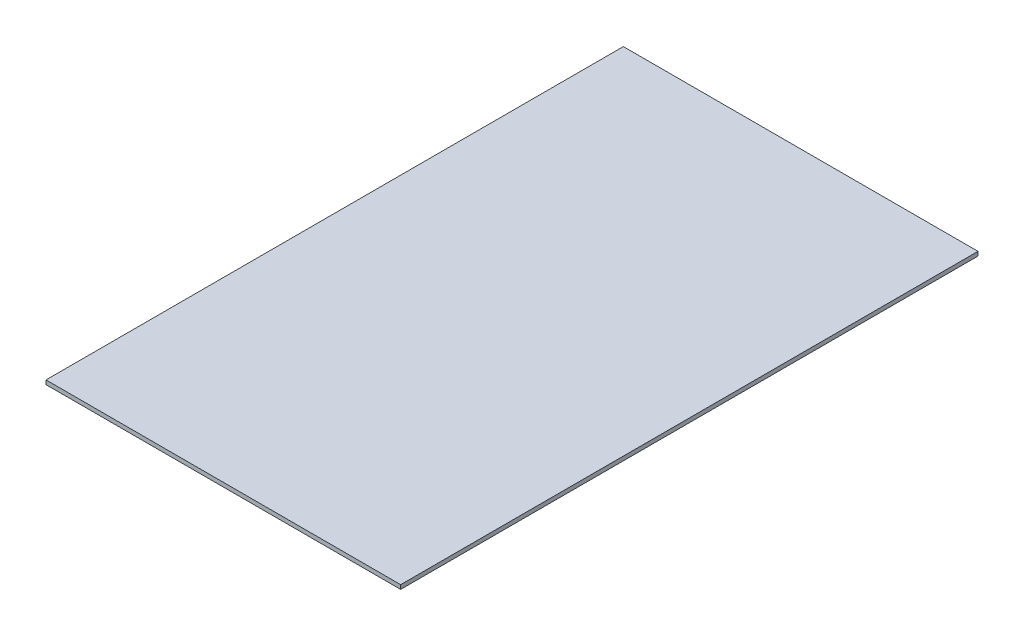
ISO-10303-21;
HEADER;
FILE_DESCRIPTION(('STEP AP214'),'2;1');
FILE_NAME('part.step','',(''),(''),'','','');
FILE_SCHEMA(('AUTOMOTIVE_DESIGN { 1 0 10303 214 1 1 1 1 }'));
ENDSEC;
DATA;
#1=APPLICATION_CONTEXT('core data for automotive mechanical design processes');
#2=APPLICATION_PROTOCOL_DEFINITION('international standard','automotive_design',2000,#1);
#3=PRODUCT_CONTEXT('',#1,'mechanical');
#4=PRODUCT('Part','Part','',(#3));
#5=PRODUCT_RELATED_PRODUCT_CATEGORY('part','',(#4));
#6=PRODUCT_DEFINITION_FORMATION('','',#4);
#7=PRODUCT_DEFINITION_CONTEXT('part definition',#1,'design');
#8=PRODUCT_DEFINITION('design','',#6,#7);
#9=PRODUCT_DEFINITION_SHAPE('','',#8);
#10=(LENGTH_UNIT() NAMED_UNIT(*) SI_UNIT(.MILLI.,.METRE.));
#11=(NAMED_UNIT(*) PLANE_ANGLE_UNIT() SI_UNIT($,.RADIAN.));
#12=(NAMED_UNIT(*) SI_UNIT($,.STERADIAN.) SOLID_ANGLE_UNIT());
#13=UNCERTAINTY_MEASURE_WITH_UNIT(LENGTH_MEASURE(1.E-05),#10,'distance_accuracy_value','');
#14=(GEOMETRIC_REPRESENTATION_CONTEXT(3) GLOBAL_UNCERTAINTY_ASSIGNED_CONTEXT((#13)) GLOBAL_UNIT_ASSIGNED_CONTEXT((#10,
#11,#12)) REPRESENTATION_CONTEXT('',''));
#15=CARTESIAN_POINT('',(0.,0.,0.));
#16=DIRECTION('',(0.,0.,1.));
#17=DIRECTION('',(1.,0.,0.));
#18=AXIS2_PLACEMENT_3D('',#15,#16,#17);
#19=CARTESIAN_POINT('',(0.,1.,0.));
#20=DIRECTION('',(1.,0.,0.));
#21=DIRECTION('',(0.,0.,-1.));
#22=AXIS2_PLACEMENT_3D('',#19,#20,#21);
#23=PLANE('',#22);
#24=DIRECTION('',(0.,0.,1.));
#25=VECTOR('',#24,1.);
#26=CARTESIAN_POINT('',(0.,0.,0.));
#27=LINE('',#26,#25);
#28=CARTESIAN_POINT('',(0.,0.,-140.));
#29=VERTEX_POINT('',#28);
#30=CARTESIAN_POINT('',(0.,0.,0.));
#31=VERTEX_POINT('',#30);
#32=EDGE_CURVE('E111',#29,#31,#27,.T.);
#33=ORIENTED_EDGE('',*,*,#32,.T.);
#34=DIRECTION('',(0.,-1.,0.));
#35=VECTOR('',#34,1.);
#36=CARTESIAN_POINT('',(0.,1.,0.));
#37=LINE('',#36,#35);
#38=CARTESIAN_POINT('',(0.,1.,0.));
#39=VERTEX_POINT('',#38);
#40=EDGE_CURVE('E11',#39,#31,#37,.T.);
#41=ORIENTED_EDGE('',*,*,#40,.F.);
#42=DIRECTION('',(0.,0.,1.));
#43=VECTOR('',#42,1.);
#44=CARTESIAN_POINT('',(0.,1.,0.));
#45=LINE('',#44,#43);
#46=CARTESIAN_POINT('',(0.,1.,-140.));
#47=VERTEX_POINT('',#46);
#48=EDGE_CURVE('E95',#47,#39,#45,.T.);
#49=ORIENTED_EDGE('',*,*,#48,.F.);
#50=DIRECTION('',(0.,-1.,0.));
#51=VECTOR('',#50,1.);
#52=CARTESIAN_POINT('',(0.,1.,-140.));
#53=LINE('',#52,#51);
#54=EDGE_CURVE('E107',#47,#29,#53,.T.);
#55=ORIENTED_EDGE('',*,*,#54,.T.);
#56=EDGE_LOOP('',(#33,#41,#49,#55));
#57=FACE_BOUND('',#56,.T.);
#58=ADVANCED_FACE('F43',(#57),#23,.F.);
#59=CARTESIAN_POINT('',(0.,1.,0.));
#60=DIRECTION('',(0.,0.,-1.));
#61=DIRECTION('',(-1.,0.,0.));
#62=AXIS2_PLACEMENT_3D('',#59,#60,#61);
#63=PLANE('',#62);
#64=DIRECTION('',(1.,0.,0.));
#65=VECTOR('',#64,1.);
#66=CARTESIAN_POINT('',(0.,0.,0.));
#67=LINE('',#66,#65);
#68=CARTESIAN_POINT('',(86.,0.,0.));
#69=VERTEX_POINT('',#68);
#70=EDGE_CURVE('E100',#31,#69,#67,.T.);
#71=ORIENTED_EDGE('',*,*,#70,.T.);
#72=DIRECTION('',(0.,-1.,0.));
#73=VECTOR('',#72,1.);
#74=CARTESIAN_POINT('',(86.,1.,0.));
#75=LINE('',#74,#73);
#76=CARTESIAN_POINT('',(86.,1.,0.));
#77=VERTEX_POINT('',#76);
#78=EDGE_CURVE('E52',#77,#69,#75,.T.);
#79=ORIENTED_EDGE('',*,*,#78,.F.);
#80=DIRECTION('',(1.,0.,0.));
#81=VECTOR('',#80,1.);
#82=CARTESIAN_POINT('',(0.,1.,0.));
#83=LINE('',#82,#81);
#84=EDGE_CURVE('E90',#39,#77,#83,.T.);
#85=ORIENTED_EDGE('',*,*,#84,.F.);
#86=ORIENTED_EDGE('',*,*,#40,.T.);
#87=EDGE_LOOP('',(#71,#79,#85,#86));
#88=FACE_BOUND('',#87,.T.);
#89=ADVANCED_FACE('F99',(#88),#63,.F.);
#90=CARTESIAN_POINT('',(86.,1.,0.));
#91=DIRECTION('',(-1.,0.,0.));
#92=DIRECTION('',(0.,0.,1.));
#93=AXIS2_PLACEMENT_3D('',#90,#91,#92);
#94=PLANE('',#93);
#95=DIRECTION('',(0.,0.,-1.));
#96=VECTOR('',#95,1.);
#97=CARTESIAN_POINT('',(86.,0.,0.));
#98=LINE('',#97,#96);
#99=CARTESIAN_POINT('',(86.,0.,-140.));
#100=VERTEX_POINT('',#99);
#101=EDGE_CURVE('E77',#69,#100,#98,.T.);
#102=ORIENTED_EDGE('',*,*,#101,.T.);
#103=DIRECTION('',(0.,-1.,0.));
#104=VECTOR('',#103,1.);
#105=CARTESIAN_POINT('',(86.,1.,-140.));
#106=LINE('',#105,#104);
#107=CARTESIAN_POINT('',(86.,1.,-140.));
#108=VERTEX_POINT('',#107);
#109=EDGE_CURVE('E102',#108,#100,#106,.T.);
#110=ORIENTED_EDGE('',*,*,#109,.F.);
#111=DIRECTION('',(0.,0.,-1.));
#112=VECTOR('',#111,1.);
#113=CARTESIAN_POINT('',(86.,1.,0.));
#114=LINE('',#113,#112);
#115=EDGE_CURVE('E93',#77,#108,#114,.T.);
#116=ORIENTED_EDGE('',*,*,#115,.F.);
#117=ORIENTED_EDGE('',*,*,#78,.T.);
#118=EDGE_LOOP('',(#102,#110,#116,#117));
#119=FACE_BOUND('',#118,.T.);
#120=ADVANCED_FACE('F103',(#119),#94,.F.);
#121=CARTESIAN_POINT('',(0.,1.,-140.));
#122=DIRECTION('',(0.,0.,1.));
#123=DIRECTION('',(1.,0.,0.));
#124=AXIS2_PLACEMENT_3D('',#121,#122,#123);
#125=PLANE('',#124);
#126=DIRECTION('',(-1.,0.,0.));
#127=VECTOR('',#126,1.);
#128=CARTESIAN_POINT('',(0.,0.,-140.));
#129=LINE('',#128,#127);
#130=EDGE_CURVE('E83',#100,#29,#129,.T.);
#131=ORIENTED_EDGE('',*,*,#130,.T.);
#132=ORIENTED_EDGE('',*,*,#54,.F.);
#133=DIRECTION('',(-1.,0.,0.));
#134=VECTOR('',#133,1.);
#135=CARTESIAN_POINT('',(0.,1.,-140.));
#136=LINE('',#135,#134);
#137=EDGE_CURVE('E60',#108,#47,#136,.T.);
#138=ORIENTED_EDGE('',*,*,#137,.F.);
#139=ORIENTED_EDGE('',*,*,#109,.T.);
#140=EDGE_LOOP('',(#131,#132,#138,#139));
#141=FACE_BOUND('',#140,.T.);
#142=ADVANCED_FACE('F124',(#141),#125,.F.);
#143=CARTESIAN_POINT('',(0.,1.,0.));
#144=DIRECTION('',(0.,-1.,0.));
#145=DIRECTION('',(0.,0.,-1.));
#146=AXIS2_PLACEMENT_3D('',#143,#144,#145);
#147=PLANE('',#146);
#148=ORIENTED_EDGE('',*,*,#48,.T.);
#149=ORIENTED_EDGE('',*,*,#84,.T.);
#150=ORIENTED_EDGE('',*,*,#115,.T.);
#151=ORIENTED_EDGE('',*,*,#137,.T.);
#152=EDGE_LOOP('',(#148,#149,#150,#151));
#153=FACE_BOUND('',#152,.T.);
#154=ADVANCED_FACE('F91',(#153),#147,.F.);
#155=CARTESIAN_POINT('',(0.,0.,0.));
#156=DIRECTION('',(0.,-1.,0.));
#157=DIRECTION('',(0.,0.,-1.));
#158=AXIS2_PLACEMENT_3D('',#155,#156,#157);
#159=PLANE('',#158);
#160=ORIENTED_EDGE('',*,*,#32,.F.);
#161=ORIENTED_EDGE('',*,*,#130,.F.);
#162=ORIENTED_EDGE('',*,*,#101,.F.);
#163=ORIENTED_EDGE('',*,*,#70,.F.);
#164=EDGE_LOOP('',(#160,#161,#162,#163));
#165=FACE_BOUND('',#164,.T.);
#166=ADVANCED_FACE('F127',(#165),#159,.T.);
#167=CLOSED_SHELL('',(#58,#89,#120,#142,#154,#166));
#168=MANIFOLD_SOLID_BREP('B2',#167);
#169=ADVANCED_BREP_SHAPE_REPRESENTATION('',(#18,#168),#14);
#170=SHAPE_DEFINITION_REPRESENTATION(#9,#169);
ENDSEC;
END-ISO-10303-21;
